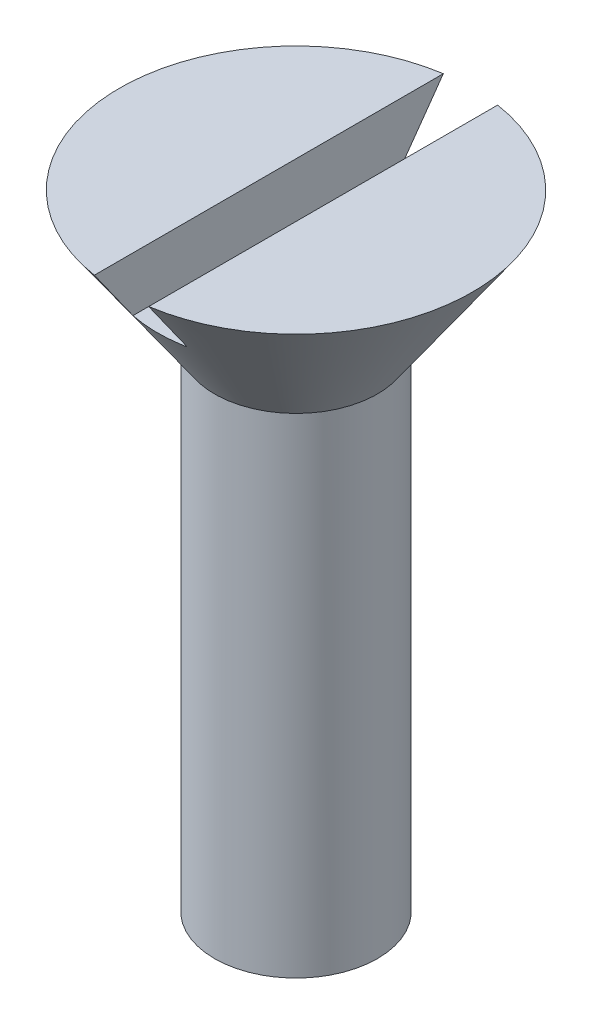
ISO-10303-21;
HEADER;
FILE_DESCRIPTION(('STEP AP214'),'2;1');
FILE_NAME('part.step','',(''),(''),'','','');
FILE_SCHEMA(('AUTOMOTIVE_DESIGN { 1 0 10303 214 1 1 1 1 }'));
ENDSEC;
DATA;
#1=APPLICATION_CONTEXT('core data for automotive mechanical design processes');
#2=APPLICATION_PROTOCOL_DEFINITION('international standard','automotive_design',2000,#1);
#3=PRODUCT_CONTEXT('',#1,'mechanical');
#4=PRODUCT('Part','Part','',(#3));
#5=PRODUCT_RELATED_PRODUCT_CATEGORY('part','',(#4));
#6=PRODUCT_DEFINITION_FORMATION('','',#4);
#7=PRODUCT_DEFINITION_CONTEXT('part definition',#1,'design');
#8=PRODUCT_DEFINITION('design','',#6,#7);
#9=PRODUCT_DEFINITION_SHAPE('','',#8);
#10=(LENGTH_UNIT() NAMED_UNIT(*) SI_UNIT(.MILLI.,.METRE.));
#11=(NAMED_UNIT(*) PLANE_ANGLE_UNIT() SI_UNIT($,.RADIAN.));
#12=(NAMED_UNIT(*) SI_UNIT($,.STERADIAN.) SOLID_ANGLE_UNIT());
#13=UNCERTAINTY_MEASURE_WITH_UNIT(LENGTH_MEASURE(1.E-05),#10,'distance_accuracy_value','');
#14=(GEOMETRIC_REPRESENTATION_CONTEXT(3) GLOBAL_UNCERTAINTY_ASSIGNED_CONTEXT((#13)) GLOBAL_UNIT_ASSIGNED_CONTEXT((#10,
#11,#12)) REPRESENTATION_CONTEXT('',''));
#15=CARTESIAN_POINT('',(0.,0.,0.));
#16=DIRECTION('',(0.,0.,1.));
#17=DIRECTION('',(1.,0.,0.));
#18=AXIS2_PLACEMENT_3D('',#15,#16,#17);
#19=CARTESIAN_POINT('',(0.,-7.77147904547305,0.));
#20=DIRECTION('',(0.,1.,0.));
#21=DIRECTION('',(0.,0.,1.00000000000002));
#22=AXIS2_PLACEMENT_3D('',#19,#20,#21);
#23=PLANE('',#22);
#24=CARTESIAN_POINT('',(0.,-7.77147904547305,0.));
#25=DIRECTION('',(0.,-1.,0.));
#26=DIRECTION('',(0.,0.,-1.00000000000002));
#27=AXIS2_PLACEMENT_3D('',#24,#25,#26);
#28=CIRCLE('',#27,6.5);
#29=CARTESIAN_POINT('',(1.,-7.77147904547305,-6.42261628933263));
#30=VERTEX_POINT('',#29);
#31=CARTESIAN_POINT('',(1.,-7.77147904547305,6.42261628933256));
#32=VERTEX_POINT('',#31);
#33=EDGE_CURVE('E110',#30,#32,#28,.T.);
#34=ORIENTED_EDGE('',*,*,#33,.F.);
#35=DIRECTION('',(0.,0.,-1.00000000000002));
#36=VECTOR('',#35,1.);
#37=CARTESIAN_POINT('',(1.00000000000001,-7.77147904547305,12.));
#38=LINE('',#37,#36);
#39=EDGE_CURVE('E120',#32,#30,#38,.T.);
#40=ORIENTED_EDGE('',*,*,#39,.F.);
#41=EDGE_LOOP('',(#34,#40));
#42=FACE_BOUND('',#41,.T.);
#43=ADVANCED_FACE('F39',(#42),#23,.T.);
#44=CARTESIAN_POINT('',(-0.999999999999987,-7.77147904547305,6.42261628933252));
#45=VERTEX_POINT('',#44);
#46=CARTESIAN_POINT('',(-1.,-7.77147904547305,-6.42261628933256));
#47=VERTEX_POINT('',#46);
#48=EDGE_CURVE('E103',#45,#47,#28,.T.);
#49=ORIENTED_EDGE('',*,*,#48,.F.);
#50=DIRECTION('',(0.,0.,-1.00000000000002));
#51=VECTOR('',#50,1.);
#52=CARTESIAN_POINT('',(-0.999999999999987,-7.77147904547305,12.));
#53=LINE('',#52,#51);
#54=EDGE_CURVE('E98',#45,#47,#53,.T.);
#55=ORIENTED_EDGE('',*,*,#54,.T.);
#56=EDGE_LOOP('',(#49,#55));
#57=FACE_BOUND('',#56,.T.);
#58=ADVANCED_FACE('F124',(#57),#23,.T.);
#59=CARTESIAN_POINT('',(0.,-12.771479045473,0.));
#60=DIRECTION('',(0.,1.,0.));
#61=DIRECTION('',(0.,0.,1.00000000000002));
#62=AXIS2_PLACEMENT_3D('',#59,#60,#61);
#63=CONICAL_SURFACE('',#62,3.,0.610725964389209);
#64=CARTESIAN_POINT('',(0.,-12.771479045473,0.));
#65=DIRECTION('',(0.,-1.,0.));
#66=DIRECTION('',(0.,0.,-1.00000000000002));
#67=AXIS2_PLACEMENT_3D('',#64,#65,#66);
#68=CIRCLE('',#67,3.);
#69=CARTESIAN_POINT('',(0.,-12.771479045473,-3.00000000000006));
#70=VERTEX_POINT('',#69);
#71=EDGE_CURVE('E114',#70,#70,#68,.T.);
#72=ORIENTED_EDGE('',*,*,#71,.F.);
#73=EDGE_LOOP('',(#72));
#74=FACE_BOUND('',#73,.T.);
#75=CARTESIAN_POINT('',(0.,-9.77147904547305,0.));
#76=DIRECTION('',(0.,1.,0.));
#77=DIRECTION('',(0.,0.,1.00000000000002));
#78=AXIS2_PLACEMENT_3D('',#75,#76,#77);
#79=CIRCLE('',#78,5.1);
#80=CARTESIAN_POINT('',(-1.00000000000001,-9.77147904547305,-5.0009999000202));
#81=VERTEX_POINT('',#80);
#82=CARTESIAN_POINT('',(0.999999999999987,-9.77147904547305,-5.00099990002013));
#83=VERTEX_POINT('',#82);
#84=EDGE_CURVE('E84',#81,#83,#79,.F.);
#85=ORIENTED_EDGE('',*,*,#84,.T.);
#86=CARTESIAN_POINT('',(0.999999999999931,0.120488817306495,11.9827231611764));
#87=CARTESIAN_POINT('',(0.999999999999985,-0.403615018251347,11.6145682106864));
#88=CARTESIAN_POINT('',(1.00000000000001,-0.927669850577706,11.2463434327953));
#89=CARTESIAN_POINT('',(1.00000000000002,-1.97563267630221,10.5096803015209));
#90=CARTESIAN_POINT('',(1.00000000000002,-2.49954066907194,10.1412419472438));
#91=CARTESIAN_POINT('',(1.00000000000001,-3.5472940844937,9.40398407783972));
#92=CARTESIAN_POINT('',(1.00000000000001,-4.07113945460641,9.03516448803785));
#93=CARTESIAN_POINT('',(1.00000000000002,-5.11854136958542,8.29711957809103));
#94=CARTESIAN_POINT('',(1.00000000000001,-5.64209791555496,7.9278942595122));
#95=CARTESIAN_POINT('',(1.00000000000001,-6.68267364938721,7.19314373791518));
#96=CARTESIAN_POINT('',(1.00000000000001,-7.19969784250939,6.82762562432928));
#97=CARTESIAN_POINT('',(1.00000000000001,-8.23309013324058,6.0956496359377));
#98=CARTESIAN_POINT('',(1.00000000000001,-8.74945822332665,5.72919175049936));
#99=CARTESIAN_POINT('',(1.00000000000001,-9.52308364786517,5.17830893819425));
#100=CARTESIAN_POINT('',(1.00000000000002,-9.78077941034659,4.99449987344683));
#101=CARTESIAN_POINT('',(1.00000000000001,-10.2957609435697,4.62630847097952));
#102=CARTESIAN_POINT('',(1.00000000000001,-10.5530467147407,4.44192613386035));
#103=CARTESIAN_POINT('',(1.00000000000002,-11.0670261610747,4.07234774760035));
#104=CARTESIAN_POINT('',(1.00000000000003,-11.3237198471474,3.88715171363824));
#105=CARTESIAN_POINT('',(1.,-11.8362249662773,3.51554375149947));
#106=CARTESIAN_POINT('',(0.999999999999967,-12.0920364054942,3.32913183183844));
#107=CARTESIAN_POINT('',(0.999999999999994,-12.4418921214384,3.07212140853257));
#108=CARTESIAN_POINT('',(1.00000000000001,-12.536557985786,3.0023694775784));
#109=CARTESIAN_POINT('',(1.00000000000002,-12.72563964682,2.86252717993864));
#110=CARTESIAN_POINT('',(1.00000000000002,-12.8200554426096,2.79243681204201));
#111=CARTESIAN_POINT('',(1.00000000000001,-13.1029023007291,2.5815174851056));
#112=CARTESIAN_POINT('',(1.00000000000001,-13.2908810087458,2.44007825904873));
#113=CARTESIAN_POINT('',(1.00000000000002,-13.5718182233209,2.22558891439174));
#114=CARTESIAN_POINT('',(1.00000000000002,-13.665525773588,2.15352042155993));
#115=CARTESIAN_POINT('',(1.00000000000001,-13.8522567439794,2.00850327603689));
#116=CARTESIAN_POINT('',(1.00000000000001,-13.9452801739542,1.93555463605868));
#117=CARTESIAN_POINT('',(1.00000000000002,-14.1303346724696,1.78851771444881));
#118=CARTESIAN_POINT('',(1.00000000000002,-14.2223662919749,1.71443012761834));
#119=CARTESIAN_POINT('',(1.00000000000001,-14.4050851886014,1.56461916611869));
#120=CARTESIAN_POINT('',(0.999999999999985,-14.4957725668879,1.48889591561152));
#121=CARTESIAN_POINT('',(0.999999999999989,-14.6609745438857,1.34718656176735));
#122=CARTESIAN_POINT('',(1.00000000000001,-14.7357854141319,1.28154677922176));
#123=CARTESIAN_POINT('',(1.00000000000002,-14.8833448269442,1.1477724458227));
#124=CARTESIAN_POINT('',(1.00000000000002,-14.9560906670069,1.07963487109236));
#125=CARTESIAN_POINT('',(1.00000000000001,-15.062431253465,0.974853354450605));
#126=CARTESIAN_POINT('',(1.00000000000001,-15.0973555713783,0.939561872044852));
#127=CARTESIAN_POINT('',(1.00000000000001,-15.1660349941154,0.867862748644507));
#128=CARTESIAN_POINT('',(1.00000000000001,-15.1997902803389,0.831455282485874));
#129=CARTESIAN_POINT('',(1.00000000000002,-15.2656716697145,0.757311303834268));
#130=CARTESIAN_POINT('',(1.00000000000002,-15.2978007895424,0.719577490139877));
#131=CARTESIAN_POINT('',(1.00000000000001,-15.3598833790103,0.642372635424132));
#132=CARTESIAN_POINT('',(0.999999999999999,-15.3898380640345,0.602902584985351));
#133=CARTESIAN_POINT('',(1.,-15.4373567554577,0.535032295243699));
#134=CARTESIAN_POINT('',(1.00000000000001,-15.455769355904,0.507232993787238));
#135=CARTESIAN_POINT('',(1.00000000000002,-15.4907701778635,0.450511838483749));
#136=CARTESIAN_POINT('',(1.00000000000002,-15.5073577628101,0.421589597683623));
#137=CARTESIAN_POINT('',(1.00000000000001,-15.5534177155717,0.333232337691756));
#138=CARTESIAN_POINT('',(0.99999999999998,-15.5794684652887,0.271829311225379));
#139=CARTESIAN_POINT('',(0.999999999999991,-15.6096671584152,0.168073043040221));
#140=CARTESIAN_POINT('',(1.00000000000001,-15.6183515061446,0.127064601771484));
#141=CARTESIAN_POINT('',(1.00000000000002,-15.6284433796489,0.0441384575675995));
#142=CARTESIAN_POINT('',(1.00000000000001,-15.6298558474281,0.00222139159792784));
#143=CARTESIAN_POINT('',(1.00000000000002,-15.625164700559,-0.0811361407881841));
#144=CARTESIAN_POINT('',(1.00000000000002,-15.6190663517712,-0.122576920579421));
#145=CARTESIAN_POINT('',(1.00000000000001,-15.6003486409174,-0.203953169966219));
#146=CARTESIAN_POINT('',(0.999999999999985,-15.5877207435267,-0.243886595679425));
#147=CARTESIAN_POINT('',(0.999999999999989,-15.5597750247724,-0.315781247385298));
#148=CARTESIAN_POINT('',(1.00000000000001,-15.5451642748779,-0.348027478861879));
#149=CARTESIAN_POINT('',(1.00000000000002,-15.513173801046,-0.411131366939776));
#150=CARTESIAN_POINT('',(1.00000000000002,-15.4957917790493,-0.44198784362));
#151=CARTESIAN_POINT('',(1.00000000000001,-15.4588596710494,-0.502535347499151));
#152=CARTESIAN_POINT('',(1.00000000000002,-15.439300807331,-0.532220950669541));
#153=CARTESIAN_POINT('',(1.00000000000001,-15.3985837785398,-0.590444750879432));
#154=CARTESIAN_POINT('',(1.,-15.377426292331,-0.61898342716816));
#155=CARTESIAN_POINT('',(0.999999999999995,-15.3124318633146,-0.702748989072341));
#156=CARTESIAN_POINT('',(1.00000000000001,-15.2667873299863,-0.756568370147319));
#157=CARTESIAN_POINT('',(1.00000000000002,-15.1724793491841,-0.861513320278138));
#158=CARTESIAN_POINT('',(1.00000000000002,-15.1238133057544,-0.912636501141968));
#159=CARTESIAN_POINT('',(1.00000000000001,-15.0243586170418,-1.0130117235456));
#160=CARTESIAN_POINT('',(1.00000000000001,-14.9735650710793,-1.0622588824576));
#161=CARTESIAN_POINT('',(1.00000000000002,-14.8705728578143,-1.15926354208419));
#162=CARTESIAN_POINT('',(1.00000000000001,-14.8183740148201,-1.20702085491038));
#163=CARTESIAN_POINT('',(1.00000000000001,-14.7126982834675,-1.30162770240181));
#164=CARTESIAN_POINT('',(1.00000000000002,-14.6592163566136,-1.34847158938016));
#165=CARTESIAN_POINT('',(1.00000000000001,-14.55147803812,-1.44126620288738));
#166=CARTESIAN_POINT('',(1.00000000000001,-14.4972215846681,-1.48721685743174));
#167=CARTESIAN_POINT('',(1.00000000000002,-14.3882092734173,-1.57832870838732));
#168=CARTESIAN_POINT('',(1.00000000000002,-14.3334544343051,-1.62349112598879));
#169=CARTESIAN_POINT('',(1.00000000000001,-14.2234799112774,-1.71324161200405));
#170=CARTESIAN_POINT('',(0.999999999999993,-14.1682602430297,-1.75782969964929));
#171=CARTESIAN_POINT('',(0.999999999999975,-14.003568724152,-1.88967706570402));
#172=CARTESIAN_POINT('',(1.,-13.8935599745075,-1.97626544175672));
#173=CARTESIAN_POINT('',(1.00000000000003,-13.6725625804066,-2.14818407092677));
#174=CARTESIAN_POINT('',(1.00000000000002,-13.5615739063283,-2.23351428580187));
#175=CARTESIAN_POINT('',(1.00000000000001,-13.2275564626553,-2.48816820191664));
#176=CARTESIAN_POINT('',(1.00000000000001,-13.0034971852194,-2.65613868788752));
#177=CARTESIAN_POINT('',(1.00000000000002,-12.5536606335464,-2.99017169753898));
#178=CARTESIAN_POINT('',(1.00000000000002,-12.3278820093938,-3.15623239280046));
#179=CARTESIAN_POINT('',(1.00000000000001,-11.8753764969852,-3.48702930994705));
#180=CARTESIAN_POINT('',(1.00000000000001,-11.6486496626361,-3.65176560561072));
#181=CARTESIAN_POINT('',(1.00000000000001,-11.1958478295807,-3.9794267712533));
#182=CARTESIAN_POINT('',(1.00000000000001,-10.9697764253371,-4.14235661588514));
#183=CARTESIAN_POINT('',(1.00000000000002,-10.5171873627832,-4.46760192862467));
#184=CARTESIAN_POINT('',(1.00000000000002,-10.2906696980868,-4.6299173878417));
#185=CARTESIAN_POINT('',(1.00000000000001,-9.61079979723305,-5.11608602019111));
#186=CARTESIAN_POINT('',(0.999999999999985,-9.15697291346549,-5.43927518137569));
#187=CARTESIAN_POINT('',(0.999999999999989,-8.33738575693966,-6.02155176944757));
#188=CARTESIAN_POINT('',(1.00000000000001,-7.97175317040998,-6.28081918039599));
#189=CARTESIAN_POINT('',(1.00000000000002,-7.24015766655039,-6.79888877666196));
#190=CARTESIAN_POINT('',(1.00000000000002,-6.87419474869765,-7.05769096124125));
#191=CARTESIAN_POINT('',(1.00000000000001,-5.77586241605184,-7.83367622880121));
#192=CARTESIAN_POINT('',(1.00000000000001,-5.04314670870471,-8.35036903080352));
#193=CARTESIAN_POINT('',(1.00000000000002,-3.57208013941439,-9.38664040791827));
#194=CARTESIAN_POINT('',(1.00000000000002,-2.83372569850909,-9.90621389931716));
#195=CARTESIAN_POINT('',(1.00000000000001,-1.35677849447009,-10.9448048696627));
#196=CARTESIAN_POINT('',(1.,-0.618185778444027,-11.4638224155917));
#197=CARTESIAN_POINT('',(0.999999999999987,0.120488817306495,-11.9827231611767));
#198=B_SPLINE_CURVE_WITH_KNOTS('',3,(#86,#87,#88,#89,#90,#91,#92,#93,#94,#95,#96,#97,#98,#99,
#100,#101,#102,#103,#104,#105,#106,#107,#108,#109,#110,#111,#112,#113,#114,#115,#116,#117,#118,
#119,#120,#121,#122,#123,#124,#125,#126,#127,#128,#129,#130,#131,#132,#133,#134,#135,#136,#137,
#138,#139,#140,#141,#142,#143,#144,#145,#146,#147,#148,#149,#150,#151,#152,#153,#154,#155,#156,
#157,#158,#159,#160,#161,#162,#163,#164,#165,#166,#167,#168,#169,#170,#171,#172,#173,#174,#175,
#176,#177,#178,#179,#180,#181,#182,#183,#184,#185,#186,#187,#188,#189,#190,#191,#192,#193,#194,
#195,#196,#197),.UNSPECIFIED.,.F.,.F.,(4,2,2,2,2,2,2,2,2,2,2,2,2,2,2,2,2,2,2,2,2,2,2,2,2,2,2,2,
2,2,2,2,2,2,2,2,2,2,2,2,2,2,2,2,2,2,2,2,2,2,2,2,2,2,2,4),(0.,1.92145941616678,3.84292693343099,
5.76489891631407,7.68686350625194,9.58640448042564,11.4859670418412,12.4355642978787,
13.3851605591792,14.3347391812541,15.2843111599379,15.6370746432562,15.9898393898135,
16.6955615935787,17.0502053975128,17.4048440850202,17.7592743982643,18.1136779008635,
18.4122249220151,18.7111461490646,18.8600792200211,19.0089890763971,19.1576117267485,
19.3061506555208,19.4061146036493,19.5061133094633,19.7047088743308,19.8299209237282,
19.9550478671773,20.0800871335928,20.2052902641623,20.3113390990573,20.4174763360791,
20.5240582192408,20.6305950934745,20.8420940642716,21.053777330501,21.265978369542,
21.4782060625095,21.6914818237435,21.9047747019443,22.117700965453,22.3306200804947,
22.7505990367858,23.1705907322806,24.0106540038439,24.8514638975051,25.6922266228768,
26.5282216312372,27.3642286912446,29.0356594149852,30.3803379296485,31.7250185763186,
34.4147376741918,37.1232638633775,39.8314153089129),.UNSPECIFIED.);
#199=EDGE_CURVE('E11',#83,#30,#198,.T.);
#200=ORIENTED_EDGE('',*,*,#199,.T.);
#201=ORIENTED_EDGE('',*,*,#33,.T.);
#202=CARTESIAN_POINT('',(0.999999999999959,-9.77147904547305,5.00099990001993));
#203=VERTEX_POINT('',#202);
#204=EDGE_CURVE('E42',#32,#203,#198,.T.);
#205=ORIENTED_EDGE('',*,*,#204,.T.);
#206=CARTESIAN_POINT('',(-0.999999999999987,-9.77147904547305,5.00099990001998));
#207=VERTEX_POINT('',#206);
#208=EDGE_CURVE('E91',#203,#207,#79,.F.);
#209=ORIENTED_EDGE('',*,*,#208,.T.);
#210=CARTESIAN_POINT('',(-1.00000000000004,0.120488817306495,-11.9827231611766));
#211=CARTESIAN_POINT('',(-1.00000000000001,-0.403615018251288,-11.6145682106865));
#212=CARTESIAN_POINT('',(-0.999999999999992,-0.927669850577617,-11.2463434327953));
#213=CARTESIAN_POINT('',(-0.999999999999982,-1.97563267630209,-10.509680301521));
#214=CARTESIAN_POINT('',(-0.999999999999985,-2.49954066907182,-10.1412419472439));
#215=CARTESIAN_POINT('',(-0.999999999999989,-3.54729408449357,-9.40398407783983));
#216=CARTESIAN_POINT('',(-0.999999999999987,-4.07113945460626,-9.03516448803796));
#217=CARTESIAN_POINT('',(-0.999999999999987,-5.11854136958526,-8.29711957809115));
#218=CARTESIAN_POINT('',(-0.999999999999987,-5.64209791555479,-7.92789425951232));
#219=CARTESIAN_POINT('',(-0.999999999999987,-6.68267364938705,-7.1931437379153));
#220=CARTESIAN_POINT('',(-0.999999999999987,-7.19969784250923,-6.82762562432939));
#221=CARTESIAN_POINT('',(-0.999999999999987,-8.23309013324044,-6.0956496359378));
#222=CARTESIAN_POINT('',(-0.999999999999988,-8.74945822332652,-5.72919175049946));
#223=CARTESIAN_POINT('',(-0.999999999999987,-9.52308364786506,-5.17830893819433));
#224=CARTESIAN_POINT('',(-0.999999999999986,-9.78077941034647,-4.99449987344692));
#225=CARTESIAN_POINT('',(-0.999999999999988,-10.2957609435696,-4.62630847097961));
#226=CARTESIAN_POINT('',(-0.99999999999999,-10.5530467147406,-4.44192613386045));
#227=CARTESIAN_POINT('',(-0.999999999999984,-11.0670261610746,-4.07234774760041));
#228=CARTESIAN_POINT('',(-0.999999999999974,-11.3237198471473,-3.88715171363826));
#229=CARTESIAN_POINT('',(-1.,-11.8362249662773,-3.51554375149958));
#230=CARTESIAN_POINT('',(-1.00000000000003,-12.0920364054943,-3.32913183183868));
#231=CARTESIAN_POINT('',(-1.00000000000001,-12.4418921214383,-3.07212140853271));
#232=CARTESIAN_POINT('',(-0.999999999999993,-12.5365579857859,-3.00236947757848));
#233=CARTESIAN_POINT('',(-0.999999999999981,-12.7256396468199,-2.86252717993867));
#234=CARTESIAN_POINT('',(-0.999999999999985,-12.8200554426096,-2.79243681204206));
#235=CARTESIAN_POINT('',(-0.999999999999991,-13.102902300729,-2.58151748510566));
#236=CARTESIAN_POINT('',(-0.999999999999988,-13.2908810087458,-2.44007825904879));
#237=CARTESIAN_POINT('',(-0.999999999999987,-13.5718182233209,-2.22558891439179));
#238=CARTESIAN_POINT('',(-0.999999999999987,-13.6655257735879,-2.15352042155997));
#239=CARTESIAN_POINT('',(-0.999999999999987,-13.8522567439793,-2.00850327603693));
#240=CARTESIAN_POINT('',(-0.999999999999988,-13.9452801739541,-1.93555463605872));
#241=CARTESIAN_POINT('',(-0.999999999999986,-14.1303346724696,-1.78851771444885));
#242=CARTESIAN_POINT('',(-0.999999999999983,-14.2223662919748,-1.71443012761838));
#243=CARTESIAN_POINT('',(-0.999999999999991,-14.4050851886014,-1.56461916611873));
#244=CARTESIAN_POINT('',(-1.,-14.4957725668879,-1.48889591561158));
#245=CARTESIAN_POINT('',(-1.,-14.6609745438857,-1.3471865617674));
#246=CARTESIAN_POINT('',(-0.99999999999999,-14.7357854141319,-1.28154677922181));
#247=CARTESIAN_POINT('',(-0.999999999999984,-14.8833448269442,-1.14777244582274));
#248=CARTESIAN_POINT('',(-0.999999999999987,-14.9560906670069,-1.07963487109241));
#249=CARTESIAN_POINT('',(-0.999999999999987,-15.062431253465,-0.974853354450648));
#250=CARTESIAN_POINT('',(-0.999999999999987,-15.0973555713783,-0.939561872044893));
#251=CARTESIAN_POINT('',(-0.999999999999987,-15.1660349941154,-0.867862748644549));
#252=CARTESIAN_POINT('',(-0.999999999999988,-15.1997902803389,-0.831455282485918));
#253=CARTESIAN_POINT('',(-0.999999999999986,-15.2656716697145,-0.757311303834316));
#254=CARTESIAN_POINT('',(-0.999999999999982,-15.2978007895424,-0.719577490139925));
#255=CARTESIAN_POINT('',(-0.999999999999992,-15.3598833790103,-0.642372635424184));
#256=CARTESIAN_POINT('',(-1.,-15.3898380640345,-0.602902584985406));
#257=CARTESIAN_POINT('',(-0.999999999999999,-15.4373567554577,-0.535032295243759));
#258=CARTESIAN_POINT('',(-0.99999999999999,-15.455769355904,-0.5072329937873));
#259=CARTESIAN_POINT('',(-0.999999999999984,-15.4907701778635,-0.450511838483822));
#260=CARTESIAN_POINT('',(-0.999999999999986,-15.5073577628101,-0.421589597683702));
#261=CARTESIAN_POINT('',(-0.99999999999999,-15.5534177155716,-0.333232337691855));
#262=CARTESIAN_POINT('',(-0.99999999999999,-15.5794684652887,-0.271829311225491));
#263=CARTESIAN_POINT('',(-0.999999999999985,-15.6096671584152,-0.168073043040344));
#264=CARTESIAN_POINT('',(-0.999999999999983,-15.6183515061446,-0.127064601771607));
#265=CARTESIAN_POINT('',(-0.999999999999991,-15.628443379649,-0.0441384575677188));
#266=CARTESIAN_POINT('',(-1.,-15.6298558474281,-0.00222139159804606));
#267=CARTESIAN_POINT('',(-0.999999999999999,-15.625164700559,0.0811361407880744));
#268=CARTESIAN_POINT('',(-0.999999999999983,-15.6190663517713,0.122576920579319));
#269=CARTESIAN_POINT('',(-0.999999999999991,-15.6003486409175,0.2039531699661));
#270=CARTESIAN_POINT('',(-1.00000000000002,-15.5877207435267,0.243886595679283));
#271=CARTESIAN_POINT('',(-1.00000000000001,-15.5597750247724,0.315781247385177));
#272=CARTESIAN_POINT('',(-0.999999999999994,-15.5451642748779,0.348027478861795));
#273=CARTESIAN_POINT('',(-0.99999999999998,-15.5131738010461,0.411131366939729));
#274=CARTESIAN_POINT('',(-0.999999999999985,-15.4957917790494,0.441987843619955));
#275=CARTESIAN_POINT('',(-0.999999999999989,-15.4588596710495,0.502535347499119));
#276=CARTESIAN_POINT('',(-0.999999999999987,-15.439300807331,0.532220950669522));
#277=CARTESIAN_POINT('',(-0.999999999999987,-15.3985837785398,0.59044475087942));
#278=CARTESIAN_POINT('',(-0.999999999999987,-15.377426292331,0.618983427168143));
#279=CARTESIAN_POINT('',(-0.999999999999987,-15.3124318633146,0.702748989072317));
#280=CARTESIAN_POINT('',(-0.999999999999987,-15.2667873299863,0.756568370147317));
#281=CARTESIAN_POINT('',(-0.999999999999987,-15.1724793491841,0.861513320278149));
#282=CARTESIAN_POINT('',(-0.999999999999987,-15.1238133057544,0.912636501141969));
#283=CARTESIAN_POINT('',(-0.999999999999987,-15.0243586170418,1.01301172354559));
#284=CARTESIAN_POINT('',(-0.999999999999987,-14.9735650710794,1.06225888245758));
#285=CARTESIAN_POINT('',(-0.999999999999987,-14.8705728578144,1.15926354208417));
#286=CARTESIAN_POINT('',(-0.999999999999987,-14.8183740148202,1.20702085491035));
#287=CARTESIAN_POINT('',(-0.999999999999987,-14.7126982834676,1.30162770240177));
#288=CARTESIAN_POINT('',(-0.999999999999987,-14.6592163566137,1.34847158938012));
#289=CARTESIAN_POINT('',(-0.999999999999987,-14.55147803812,1.44126620288733));
#290=CARTESIAN_POINT('',(-0.999999999999989,-14.4972215846682,1.48721685743169));
#291=CARTESIAN_POINT('',(-0.999999999999985,-14.3882092734174,1.57832870838728));
#292=CARTESIAN_POINT('',(-0.999999999999981,-14.3334544343052,1.62349112598876));
#293=CARTESIAN_POINT('',(-0.999999999999993,-14.2234799112775,1.71324161200397));
#294=CARTESIAN_POINT('',(-1.00000000000001,-14.1682602430297,1.75782969964914));
#295=CARTESIAN_POINT('',(-1.00000000000003,-14.0035687241519,1.88967706570379));
#296=CARTESIAN_POINT('',(-0.999999999999998,-13.8935599745075,1.97626544175663));
#297=CARTESIAN_POINT('',(-0.999999999999976,-13.6725625804067,2.14818407092679));
#298=CARTESIAN_POINT('',(-0.999999999999983,-13.5615739063284,2.23351428580186));
#299=CARTESIAN_POINT('',(-0.999999999999995,-13.2275564626553,2.48816820191659));
#300=CARTESIAN_POINT('',(-0.999999999999989,-13.0034971852194,2.6561386878875));
#301=CARTESIAN_POINT('',(-0.999999999999985,-12.5536606335464,2.99017169753898));
#302=CARTESIAN_POINT('',(-0.999999999999987,-12.3278820093938,3.15623239280046));
#303=CARTESIAN_POINT('',(-0.999999999999987,-11.8753764969852,3.48702930994705));
#304=CARTESIAN_POINT('',(-0.999999999999987,-11.6486496626361,3.65176560561073));
#305=CARTESIAN_POINT('',(-0.999999999999987,-11.1958478295807,3.97942677125332));
#306=CARTESIAN_POINT('',(-0.999999999999988,-10.9697764253371,4.14235661588515));
#307=CARTESIAN_POINT('',(-0.999999999999986,-10.5171873627832,4.46760192862468));
#308=CARTESIAN_POINT('',(-0.999999999999984,-10.2906696980868,4.62991738784172));
#309=CARTESIAN_POINT('',(-0.999999999999992,-9.61079979723303,5.11608602019111));
#310=CARTESIAN_POINT('',(-1.00000000000002,-9.15697291346543,5.43927518137563));
#311=CARTESIAN_POINT('',(-1.00000000000001,-8.33738575693963,6.02155176944751));
#312=CARTESIAN_POINT('',(-0.999999999999994,-7.97175317040999,6.28081918039596));
#313=CARTESIAN_POINT('',(-0.99999999999998,-7.24015766655045,6.79888877666194));
#314=CARTESIAN_POINT('',(-0.999999999999984,-6.87419474869773,7.05769096124121));
#315=CARTESIAN_POINT('',(-0.999999999999992,-5.77586241605195,7.83367622880112));
#316=CARTESIAN_POINT('',(-0.999999999999991,-5.04314670870485,8.35036903080342));
#317=CARTESIAN_POINT('',(-0.999999999999983,-3.57208013941457,9.38664040791816));
#318=CARTESIAN_POINT('',(-0.999999999999976,-2.83372569850928,9.90621389931706));
#319=CARTESIAN_POINT('',(-0.999999999999998,-1.35677849447024,10.9448048696626));
#320=CARTESIAN_POINT('',(-1.00000000000003,-0.618185778444131,11.4638224155914));
#321=CARTESIAN_POINT('',(-1.0000000000001,0.120488817306495,11.9827231611764));
#322=B_SPLINE_CURVE_WITH_KNOTS('',3,(#210,#211,#212,#213,#214,#215,#216,#217,#218,#219,#220,
#221,#222,#223,#224,#225,#226,#227,#228,#229,#230,#231,#232,#233,#234,#235,#236,#237,#238,#239,
#240,#241,#242,#243,#244,#245,#246,#247,#248,#249,#250,#251,#252,#253,#254,#255,#256,#257,#258,
#259,#260,#261,#262,#263,#264,#265,#266,#267,#268,#269,#270,#271,#272,#273,#274,#275,#276,#277,
#278,#279,#280,#281,#282,#283,#284,#285,#286,#287,#288,#289,#290,#291,#292,#293,#294,#295,#296,
#297,#298,#299,#300,#301,#302,#303,#304,#305,#306,#307,#308,#309,#310,#311,#312,#313,#314,#315,
#316,#317,#318,#319,#320,#321),.UNSPECIFIED.,.F.,.F.,(4,2,2,2,2,2,2,2,2,2,2,2,2,2,2,2,2,2,2,2,2,
2,2,2,2,2,2,2,2,2,2,2,2,2,2,2,2,2,2,2,2,2,2,2,2,2,2,2,2,2,2,2,2,2,2,4),(0.,1.92145941616675,
3.84292693343093,5.76489891631398,7.68686350625182,9.58640448042555,11.4859670418412,
12.4355642978787,13.3851605591792,14.3347391812541,15.2843111599379,15.6370746432562,
15.9898393898135,16.6955615935787,17.0502053975129,17.4048440850203,17.7592743982644,
18.1136779008636,18.4122249220151,18.7111461490647,18.8600792200211,19.0089890763972,
19.1576117267485,19.3061506555208,19.4061146036493,19.5061133094634,19.7047088743307,
19.8299209237282,19.9550478671773,20.0800871335928,20.2052902641623,20.3113390990574,
20.4174763360792,20.5240582192409,20.6305950934746,20.8420940642717,21.0537773305011,
21.2659783695421,21.4782060625096,21.6914818237436,21.9047747019443,22.117700965453,
22.3306200804947,22.7505990367858,23.1705907322807,24.010654003844,24.8514638975052,
25.6922266228769,26.5282216312373,27.3642286912448,29.0356594149853,30.3803379296485,
31.7250185763186,34.4147376741917,37.1232638633774,39.8314153089129),.UNSPECIFIED.);
#323=EDGE_CURVE('E96',#207,#45,#322,.T.);
#324=ORIENTED_EDGE('',*,*,#323,.T.);
#325=ORIENTED_EDGE('',*,*,#48,.T.);
#326=EDGE_CURVE('E52',#47,#81,#322,.T.);
#327=ORIENTED_EDGE('',*,*,#326,.T.);
#328=EDGE_LOOP('',(#85,#200,#201,#205,#209,#324,#325,#327));
#329=FACE_BOUND('',#328,.T.);
#330=ADVANCED_FACE('F101',(#74,#329),#63,.T.);
#331=CARTESIAN_POINT('',(0.,-32.5035298530419,0.));
#332=DIRECTION('',(0.,-1.,0.));
#333=DIRECTION('',(0.,0.,-1.00000000000002));
#334=AXIS2_PLACEMENT_3D('',#331,#332,#333);
#335=CYLINDRICAL_SURFACE('',#334,3.);
#336=ORIENTED_EDGE('',*,*,#71,.T.);
#337=EDGE_LOOP('',(#336));
#338=FACE_BOUND('',#337,.T.);
#339=CARTESIAN_POINT('',(0.,-30.771479045473,0.));
#340=DIRECTION('',(0.,-1.,0.));
#341=DIRECTION('',(0.,0.,-1.00000000000002));
#342=AXIS2_PLACEMENT_3D('',#339,#340,#341);
#343=CIRCLE('',#342,3.);
#344=CARTESIAN_POINT('',(0.,-30.771479045473,-3.00000000000006));
#345=VERTEX_POINT('',#344);
#346=EDGE_CURVE('E117',#345,#345,#343,.T.);
#347=ORIENTED_EDGE('',*,*,#346,.F.);
#348=EDGE_LOOP('',(#347));
#349=FACE_BOUND('',#348,.T.);
#350=ADVANCED_FACE('F130',(#338,#349),#335,.T.);
#351=CARTESIAN_POINT('',(0.,-32.5035298530419,0.));
#352=DIRECTION('',(0.,1.,0.));
#353=DIRECTION('',(0.,0.,1.00000000000002));
#354=AXIS2_PLACEMENT_3D('',#351,#352,#353);
#355=CONICAL_SURFACE('',#354,0.,1.04719755119659);
#356=ORIENTED_EDGE('',*,*,#346,.T.);
#357=EDGE_LOOP('',(#356));
#358=FACE_BOUND('',#357,.T.);
#359=CARTESIAN_POINT('',(0.,-32.5035298530419,0.));
#360=VERTEX_POINT('',#359);
#361=VERTEX_LOOP('',#360);
#362=FACE_BOUND('',#361,.T.);
#363=ADVANCED_FACE('F140',(#358,#362),#355,.T.);
#364=CARTESIAN_POINT('',(1.00000000000001,-7.77147904547305,12.));
#365=DIRECTION('',(-1.00000000000002,0.,0.));
#366=DIRECTION('',(0.,0.,1.00000000000002));
#367=AXIS2_PLACEMENT_3D('',#364,#365,#366);
#368=PLANE('',#367);
#369=ORIENTED_EDGE('',*,*,#39,.T.);
#370=ORIENTED_EDGE('',*,*,#199,.F.);
#371=DIRECTION('',(0.,0.,-1.00000000000002));
#372=VECTOR('',#371,1.);
#373=CARTESIAN_POINT('',(1.00000000000001,-9.77147904547305,12.));
#374=LINE('',#373,#372);
#375=EDGE_CURVE('E87',#203,#83,#374,.T.);
#376=ORIENTED_EDGE('',*,*,#375,.F.);
#377=ORIENTED_EDGE('',*,*,#204,.F.);
#378=EDGE_LOOP('',(#369,#370,#376,#377));
#379=FACE_BOUND('',#378,.T.);
#380=ADVANCED_FACE('F138',(#379),#368,.T.);
#381=CARTESIAN_POINT('',(-0.999999999999987,-7.77147904547305,12.));
#382=DIRECTION('',(1.00000000000002,0.,0.));
#383=DIRECTION('',(0.,0.,-1.00000000000002));
#384=AXIS2_PLACEMENT_3D('',#381,#382,#383);
#385=PLANE('',#384);
#386=ORIENTED_EDGE('',*,*,#54,.F.);
#387=ORIENTED_EDGE('',*,*,#323,.F.);
#388=DIRECTION('',(0.,0.,-1.00000000000002));
#389=VECTOR('',#388,1.);
#390=CARTESIAN_POINT('',(-0.999999999999987,-9.77147904547305,12.));
#391=LINE('',#390,#389);
#392=EDGE_CURVE('E59',#207,#81,#391,.T.);
#393=ORIENTED_EDGE('',*,*,#392,.T.);
#394=ORIENTED_EDGE('',*,*,#326,.F.);
#395=EDGE_LOOP('',(#386,#387,#393,#394));
#396=FACE_BOUND('',#395,.T.);
#397=ADVANCED_FACE('F93',(#396),#385,.T.);
#398=CARTESIAN_POINT('',(1.00000000000001,-9.77147904547305,12.));
#399=DIRECTION('',(0.,1.,0.));
#400=DIRECTION('',(0.,0.,1.00000000000002));
#401=AXIS2_PLACEMENT_3D('',#398,#399,#400);
#402=PLANE('',#401);
#403=ORIENTED_EDGE('',*,*,#392,.F.);
#404=ORIENTED_EDGE('',*,*,#208,.F.);
#405=ORIENTED_EDGE('',*,*,#375,.T.);
#406=ORIENTED_EDGE('',*,*,#84,.F.);
#407=EDGE_LOOP('',(#403,#404,#405,#406));
#408=FACE_BOUND('',#407,.T.);
#409=ADVANCED_FACE('F85',(#408),#402,.T.);
#410=CLOSED_SHELL('',(#43,#58,#330,#350,#363,#380,#397,#409));
#411=MANIFOLD_SOLID_BREP('B2',#410);
#412=ADVANCED_BREP_SHAPE_REPRESENTATION('',(#18,#411),#14);
#413=SHAPE_DEFINITION_REPRESENTATION(#9,#412);
ENDSEC;
END-ISO-10303-21;
